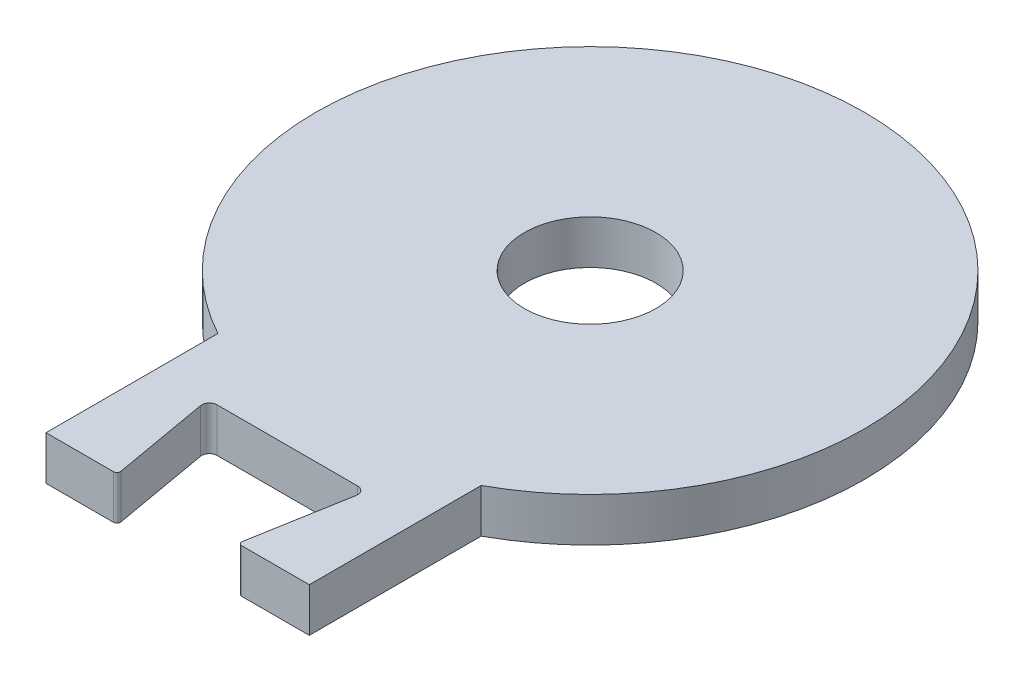
ISO-10303-21;
HEADER;
FILE_DESCRIPTION(('STEP AP214'),'2;1');
FILE_NAME('part.step','',(''),(''),'','','');
FILE_SCHEMA(('AUTOMOTIVE_DESIGN { 1 0 10303 214 1 1 1 1 }'));
ENDSEC;
DATA;
#1=APPLICATION_CONTEXT('core data for automotive mechanical design processes');
#2=APPLICATION_PROTOCOL_DEFINITION('international standard','automotive_design',2000,#1);
#3=PRODUCT_CONTEXT('',#1,'mechanical');
#4=PRODUCT('Part','Part','',(#3));
#5=PRODUCT_RELATED_PRODUCT_CATEGORY('part','',(#4));
#6=PRODUCT_DEFINITION_FORMATION('','',#4);
#7=PRODUCT_DEFINITION_CONTEXT('part definition',#1,'design');
#8=PRODUCT_DEFINITION('design','',#6,#7);
#9=PRODUCT_DEFINITION_SHAPE('','',#8);
#10=(LENGTH_UNIT() NAMED_UNIT(*) SI_UNIT(.MILLI.,.METRE.));
#11=(NAMED_UNIT(*) PLANE_ANGLE_UNIT() SI_UNIT($,.RADIAN.));
#12=(NAMED_UNIT(*) SI_UNIT($,.STERADIAN.) SOLID_ANGLE_UNIT());
#13=UNCERTAINTY_MEASURE_WITH_UNIT(LENGTH_MEASURE(1.E-05),#10,'distance_accuracy_value','');
#14=(GEOMETRIC_REPRESENTATION_CONTEXT(3) GLOBAL_UNCERTAINTY_ASSIGNED_CONTEXT((#13)) GLOBAL_UNIT_ASSIGNED_CONTEXT((#10,
#11,#12)) REPRESENTATION_CONTEXT('',''));
#15=CARTESIAN_POINT('',(0.,0.,0.));
#16=DIRECTION('',(0.,0.,1.));
#17=DIRECTION('',(1.,0.,0.));
#18=AXIS2_PLACEMENT_3D('',#15,#16,#17);
#19=CARTESIAN_POINT('',(-6.,2.,13.2915026221292));
#20=DIRECTION('',(1.,0.,0.));
#21=DIRECTION('',(0.,0.,-1.));
#22=AXIS2_PLACEMENT_3D('',#19,#20,#21);
#23=PLANE('',#22);
#24=DIRECTION('',(0.,0.,1.));
#25=VECTOR('',#24,1.);
#26=CARTESIAN_POINT('',(-6.,0.,13.2915026221292));
#27=LINE('',#26,#25);
#28=CARTESIAN_POINT('',(-6.,0.,10.9658560997307));
#29=VERTEX_POINT('',#28);
#30=CARTESIAN_POINT('',(-6.,0.,18.8));
#31=VERTEX_POINT('',#30);
#32=EDGE_CURVE('E171',#29,#31,#27,.T.);
#33=ORIENTED_EDGE('',*,*,#32,.T.);
#34=DIRECTION('',(0.,1.,0.));
#35=VECTOR('',#34,1.);
#36=CARTESIAN_POINT('',(-6.,-2.,18.8));
#37=LINE('',#36,#35);
#38=CARTESIAN_POINT('',(-6.,2.,18.8));
#39=VERTEX_POINT('',#38);
#40=EDGE_CURVE('E144',#31,#39,#37,.T.);
#41=ORIENTED_EDGE('',*,*,#40,.T.);
#42=DIRECTION('',(0.,0.,1.));
#43=VECTOR('',#42,1.);
#44=CARTESIAN_POINT('',(-6.,2.,-6.));
#45=LINE('',#44,#43);
#46=CARTESIAN_POINT('',(-6.,2.,10.9658560997307));
#47=VERTEX_POINT('',#46);
#48=EDGE_CURVE('E186',#47,#39,#45,.T.);
#49=ORIENTED_EDGE('',*,*,#48,.F.);
#50=DIRECTION('',(0.,-1.,0.));
#51=VECTOR('',#50,1.);
#52=CARTESIAN_POINT('',(-6.,2.,10.9658560997307));
#53=LINE('',#52,#51);
#54=EDGE_CURVE('E250',#29,#47,#53,.F.);
#55=ORIENTED_EDGE('',*,*,#54,.F.);
#56=EDGE_LOOP('',(#33,#41,#49,#55));
#57=FACE_BOUND('',#56,.T.);
#58=ADVANCED_FACE('F39',(#57),#23,.F.);
#59=CARTESIAN_POINT('',(6.,2.,13.2915026221292));
#60=DIRECTION('',(-1.,0.,0.));
#61=DIRECTION('',(0.,0.,1.));
#62=AXIS2_PLACEMENT_3D('',#59,#60,#61);
#63=PLANE('',#62);
#64=DIRECTION('',(0.,0.,-1.));
#65=VECTOR('',#64,1.);
#66=CARTESIAN_POINT('',(6.,2.,19.));
#67=LINE('',#66,#65);
#68=CARTESIAN_POINT('',(6.,2.,18.8));
#69=VERTEX_POINT('',#68);
#70=CARTESIAN_POINT('',(6.,2.,10.9658560997307));
#71=VERTEX_POINT('',#70);
#72=EDGE_CURVE('E151',#69,#71,#67,.T.);
#73=ORIENTED_EDGE('',*,*,#72,.F.);
#74=DIRECTION('',(0.,1.,0.));
#75=VECTOR('',#74,1.);
#76=CARTESIAN_POINT('',(6.,-2.,18.8));
#77=LINE('',#76,#75);
#78=CARTESIAN_POINT('',(6.,0.,18.8));
#79=VERTEX_POINT('',#78);
#80=EDGE_CURVE('E134',#79,#69,#77,.T.);
#81=ORIENTED_EDGE('',*,*,#80,.F.);
#82=DIRECTION('',(0.,0.,-1.));
#83=VECTOR('',#82,1.);
#84=CARTESIAN_POINT('',(6.,0.,13.2915026221292));
#85=LINE('',#84,#83);
#86=CARTESIAN_POINT('',(6.,0.,10.9658560997307));
#87=VERTEX_POINT('',#86);
#88=EDGE_CURVE('E184',#79,#87,#85,.T.);
#89=ORIENTED_EDGE('',*,*,#88,.T.);
#90=DIRECTION('',(0.,-1.,0.));
#91=VECTOR('',#90,1.);
#92=CARTESIAN_POINT('',(6.,2.,10.9658560997307));
#93=LINE('',#92,#91);
#94=EDGE_CURVE('E158',#71,#87,#93,.T.);
#95=ORIENTED_EDGE('',*,*,#94,.F.);
#96=EDGE_LOOP('',(#73,#81,#89,#95));
#97=FACE_BOUND('',#96,.T.);
#98=ADVANCED_FACE('F156',(#97),#63,.F.);
#99=CARTESIAN_POINT('',(0.,2.,0.));
#100=DIRECTION('',(0.,1.,0.));
#101=DIRECTION('',(0.,0.,1.));
#102=AXIS2_PLACEMENT_3D('',#99,#100,#101);
#103=PLANE('',#102);
#104=DIRECTION('',(-0.173648177666934,0.,0.984807753012207));
#105=VECTOR('',#104,1.);
#106=CARTESIAN_POINT('',(2.70227505957538,2.,19.));
#107=LINE('',#106,#105);
#108=CARTESIAN_POINT('',(3.54674431540572,2.,14.2107768621834));
#109=VERTEX_POINT('',#108);
#110=CARTESIAN_POINT('',(2.76858233165438,2.,18.62395277335));
#111=VERTEX_POINT('',#110);
#112=EDGE_CURVE('E161',#109,#111,#107,.T.);
#113=ORIENTED_EDGE('',*,*,#112,.T.);
#114=CARTESIAN_POINT('',(2.91630349460621,2.,18.65));
#115=DIRECTION('',(0.,1.,0.));
#116=DIRECTION('',(0.,0.,1.));
#117=AXIS2_PLACEMENT_3D('',#114,#115,#116);
#118=CIRCLE('',#117,0.15);
#119=CARTESIAN_POINT('',(2.91630349460621,2.,18.8));
#120=VERTEX_POINT('',#119);
#121=EDGE_CURVE('E153',#111,#120,#118,.T.);
#122=ORIENTED_EDGE('',*,*,#121,.T.);
#123=DIRECTION('',(-1.,0.,0.));
#124=VECTOR('',#123,1.);
#125=CARTESIAN_POINT('',(-6.,2.,18.8));
#126=LINE('',#125,#124);
#127=EDGE_CURVE('E137',#69,#120,#126,.T.);
#128=ORIENTED_EDGE('',*,*,#127,.F.);
#129=ORIENTED_EDGE('',*,*,#72,.T.);
#130=CARTESIAN_POINT('',(0.,2.,0.));
#131=DIRECTION('',(0.,1.,0.));
#132=DIRECTION('',(0.,0.,1.));
#133=AXIS2_PLACEMENT_3D('',#130,#131,#132);
#134=CIRCLE('',#133,12.5);
#135=EDGE_CURVE('E256',#71,#47,#134,.T.);
#136=ORIENTED_EDGE('',*,*,#135,.T.);
#137=ORIENTED_EDGE('',*,*,#48,.T.);
#138=CARTESIAN_POINT('',(-2.91630349460621,2.,18.8));
#139=VERTEX_POINT('',#138);
#140=EDGE_CURVE('E154',#139,#39,#126,.T.);
#141=ORIENTED_EDGE('',*,*,#140,.F.);
#142=CARTESIAN_POINT('',(-2.91630349460621,2.,18.65));
#143=DIRECTION('',(0.,1.,0.));
#144=DIRECTION('',(0.,0.,1.));
#145=AXIS2_PLACEMENT_3D('',#142,#143,#144);
#146=CIRCLE('',#145,0.15);
#147=CARTESIAN_POINT('',(-2.76858233165438,2.,18.62395277335));
#148=VERTEX_POINT('',#147);
#149=EDGE_CURVE('E215',#139,#148,#146,.T.);
#150=ORIENTED_EDGE('',*,*,#149,.T.);
#151=DIRECTION('',(-0.173648177666935,0.,-0.984807753012207));
#152=VECTOR('',#151,1.);
#153=CARTESIAN_POINT('',(-2.70227505957538,2.,19.));
#154=LINE('',#153,#152);
#155=CARTESIAN_POINT('',(-3.54674431540572,2.,14.2107768621834));
#156=VERTEX_POINT('',#155);
#157=EDGE_CURVE('E225',#148,#156,#154,.T.);
#158=ORIENTED_EDGE('',*,*,#157,.T.);
#159=CARTESIAN_POINT('',(-3.20206160185145,2.,14.15));
#160=DIRECTION('',(0.,1.,0.));
#161=DIRECTION('',(0.,0.,1.));
#162=AXIS2_PLACEMENT_3D('',#159,#160,#161);
#163=CIRCLE('',#162,0.35);
#164=CARTESIAN_POINT('',(-3.20206160185145,2.,13.8));
#165=VERTEX_POINT('',#164);
#166=EDGE_CURVE('E209',#156,#165,#163,.F.);
#167=ORIENTED_EDGE('',*,*,#166,.T.);
#168=DIRECTION('',(1.,0.,0.));
#169=VECTOR('',#168,1.);
#170=CARTESIAN_POINT('',(-3.61917535925942,2.,13.8));
#171=LINE('',#170,#169);
#172=CARTESIAN_POINT('',(3.20206160185144,2.,13.8));
#173=VERTEX_POINT('',#172);
#174=EDGE_CURVE('E167',#165,#173,#171,.T.);
#175=ORIENTED_EDGE('',*,*,#174,.T.);
#176=CARTESIAN_POINT('',(3.20206160185145,2.,14.15));
#177=DIRECTION('',(0.,1.,0.));
#178=DIRECTION('',(0.,0.,1.));
#179=AXIS2_PLACEMENT_3D('',#176,#177,#178);
#180=CIRCLE('',#179,0.35);
#181=EDGE_CURVE('E203',#173,#109,#180,.F.);
#182=ORIENTED_EDGE('',*,*,#181,.T.);
#183=EDGE_LOOP('',(#113,#122,#128,#129,#136,#137,#141,#150,#158,#167,#175,#182));
#184=FACE_BOUND('',#183,.T.);
#185=CARTESIAN_POINT('',(0.,2.,0.));
#186=DIRECTION('',(0.,1.,0.));
#187=DIRECTION('',(0.,0.,1.));
#188=AXIS2_PLACEMENT_3D('',#185,#186,#187);
#189=CIRCLE('',#188,3.);
#190=CARTESIAN_POINT('',(0.,2.,3.));
#191=VERTEX_POINT('',#190);
#192=EDGE_CURVE('E176',#191,#191,#189,.T.);
#193=ORIENTED_EDGE('',*,*,#192,.F.);
#194=EDGE_LOOP('',(#193));
#195=FACE_BOUND('',#194,.T.);
#196=ADVANCED_FACE('F148',(#184,#195),#103,.T.);
#197=CARTESIAN_POINT('',(0.,0.,0.));
#198=DIRECTION('',(0.,1.,0.));
#199=DIRECTION('',(0.,0.,1.));
#200=AXIS2_PLACEMENT_3D('',#197,#198,#199);
#201=PLANE('',#200);
#202=DIRECTION('',(-1.,0.,0.));
#203=VECTOR('',#202,1.);
#204=CARTESIAN_POINT('',(0.,0.,18.8));
#205=LINE('',#204,#203);
#206=CARTESIAN_POINT('',(2.91630349460621,0.,18.8));
#207=VERTEX_POINT('',#206);
#208=EDGE_CURVE('E140',#79,#207,#205,.T.);
#209=ORIENTED_EDGE('',*,*,#208,.T.);
#210=CARTESIAN_POINT('',(2.91630349460621,0.,18.65));
#211=DIRECTION('',(0.,1.,0.));
#212=DIRECTION('',(0.,0.,1.));
#213=AXIS2_PLACEMENT_3D('',#210,#211,#212);
#214=CIRCLE('',#213,0.15);
#215=CARTESIAN_POINT('',(2.76858233165438,0.,18.62395277335));
#216=VERTEX_POINT('',#215);
#217=EDGE_CURVE('E221',#207,#216,#214,.F.);
#218=ORIENTED_EDGE('',*,*,#217,.T.);
#219=DIRECTION('',(-0.173648177666934,0.,0.984807753012207));
#220=VECTOR('',#219,1.);
#221=CARTESIAN_POINT('',(2.70227505957538,0.,19.));
#222=LINE('',#221,#220);
#223=CARTESIAN_POINT('',(3.54674431540572,0.,14.2107768621834));
#224=VERTEX_POINT('',#223);
#225=EDGE_CURVE('E181',#224,#216,#222,.T.);
#226=ORIENTED_EDGE('',*,*,#225,.F.);
#227=CARTESIAN_POINT('',(3.20206160185145,0.,14.15));
#228=DIRECTION('',(0.,1.,0.));
#229=DIRECTION('',(0.,0.,1.));
#230=AXIS2_PLACEMENT_3D('',#227,#228,#229);
#231=CIRCLE('',#230,0.35);
#232=CARTESIAN_POINT('',(3.20206160185145,0.,13.8));
#233=VERTEX_POINT('',#232);
#234=EDGE_CURVE('E201',#224,#233,#231,.T.);
#235=ORIENTED_EDGE('',*,*,#234,.T.);
#236=DIRECTION('',(1.,0.,0.));
#237=VECTOR('',#236,1.);
#238=CARTESIAN_POINT('',(3.61917535925942,0.,13.8));
#239=LINE('',#238,#237);
#240=CARTESIAN_POINT('',(-3.20206160185144,0.,13.8));
#241=VERTEX_POINT('',#240);
#242=EDGE_CURVE('E178',#241,#233,#239,.T.);
#243=ORIENTED_EDGE('',*,*,#242,.F.);
#244=CARTESIAN_POINT('',(-3.20206160185145,0.,14.15));
#245=DIRECTION('',(0.,1.,0.));
#246=DIRECTION('',(0.,0.,1.));
#247=AXIS2_PLACEMENT_3D('',#244,#245,#246);
#248=CIRCLE('',#247,0.35);
#249=CARTESIAN_POINT('',(-3.54674431540572,0.,14.2107768621834));
#250=VERTEX_POINT('',#249);
#251=EDGE_CURVE('E206',#241,#250,#248,.T.);
#252=ORIENTED_EDGE('',*,*,#251,.T.);
#253=DIRECTION('',(-0.173648177666935,0.,-0.984807753012207));
#254=VECTOR('',#253,1.);
#255=CARTESIAN_POINT('',(-2.70227505957538,0.,19.));
#256=LINE('',#255,#254);
#257=CARTESIAN_POINT('',(-2.76858233165438,0.,18.62395277335));
#258=VERTEX_POINT('',#257);
#259=EDGE_CURVE('E175',#258,#250,#256,.T.);
#260=ORIENTED_EDGE('',*,*,#259,.F.);
#261=CARTESIAN_POINT('',(-2.91630349460621,0.,18.65));
#262=DIRECTION('',(0.,1.,0.));
#263=DIRECTION('',(0.,0.,1.));
#264=AXIS2_PLACEMENT_3D('',#261,#262,#263);
#265=CIRCLE('',#264,0.15);
#266=CARTESIAN_POINT('',(-2.91630349460621,0.,18.8));
#267=VERTEX_POINT('',#266);
#268=EDGE_CURVE('E54',#258,#267,#265,.F.);
#269=ORIENTED_EDGE('',*,*,#268,.T.);
#270=EDGE_CURVE('E261',#267,#31,#205,.T.);
#271=ORIENTED_EDGE('',*,*,#270,.T.);
#272=ORIENTED_EDGE('',*,*,#32,.F.);
#273=CARTESIAN_POINT('',(0.,0.,0.));
#274=DIRECTION('',(0.,1.,0.));
#275=DIRECTION('',(0.,0.,1.));
#276=AXIS2_PLACEMENT_3D('',#273,#274,#275);
#277=CIRCLE('',#276,12.5);
#278=EDGE_CURVE('E257',#87,#29,#277,.T.);
#279=ORIENTED_EDGE('',*,*,#278,.F.);
#280=ORIENTED_EDGE('',*,*,#88,.F.);
#281=EDGE_LOOP('',(#209,#218,#226,#235,#243,#252,#260,#269,#271,#272,#279,#280));
#282=FACE_BOUND('',#281,.T.);
#283=CARTESIAN_POINT('',(0.,0.,0.));
#284=DIRECTION('',(0.,1.,0.));
#285=DIRECTION('',(0.,0.,1.));
#286=AXIS2_PLACEMENT_3D('',#283,#284,#285);
#287=CIRCLE('',#286,3.);
#288=CARTESIAN_POINT('',(0.,0.,3.));
#289=VERTEX_POINT('',#288);
#290=EDGE_CURVE('E247',#289,#289,#287,.T.);
#291=ORIENTED_EDGE('',*,*,#290,.T.);
#292=EDGE_LOOP('',(#291));
#293=FACE_BOUND('',#292,.T.);
#294=ADVANCED_FACE('F227',(#282,#293),#201,.F.);
#295=CARTESIAN_POINT('',(-2.70227505957538,2.,19.));
#296=DIRECTION('',(-0.984807753012207,0.,0.173648177666935));
#297=DIRECTION('',(0.173648177666935,0.,0.984807753012207));
#298=AXIS2_PLACEMENT_3D('',#295,#296,#297);
#299=PLANE('',#298);
#300=ORIENTED_EDGE('',*,*,#157,.F.);
#301=DIRECTION('',(0.,-1.,0.));
#302=VECTOR('',#301,1.);
#303=CARTESIAN_POINT('',(-2.76858233165438,2.,18.62395277335));
#304=LINE('',#303,#302);
#305=EDGE_CURVE('E47',#148,#258,#304,.T.);
#306=ORIENTED_EDGE('',*,*,#305,.T.);
#307=ORIENTED_EDGE('',*,*,#259,.T.);
#308=DIRECTION('',(0.,-1.,0.));
#309=VECTOR('',#308,1.);
#310=CARTESIAN_POINT('',(-3.54674431540572,2.,14.2107768621834));
#311=LINE('',#310,#309);
#312=EDGE_CURVE('E198',#250,#156,#311,.F.);
#313=ORIENTED_EDGE('',*,*,#312,.T.);
#314=EDGE_LOOP('',(#300,#306,#307,#313));
#315=FACE_BOUND('',#314,.T.);
#316=ADVANCED_FACE('F224',(#315),#299,.F.);
#317=CARTESIAN_POINT('',(3.61917535925942,2.,13.8));
#318=DIRECTION('',(0.,0.,-1.));
#319=DIRECTION('',(-1.,0.,0.));
#320=AXIS2_PLACEMENT_3D('',#317,#318,#319);
#321=PLANE('',#320);
#322=ORIENTED_EDGE('',*,*,#242,.T.);
#323=DIRECTION('',(0.,-1.,0.));
#324=VECTOR('',#323,1.);
#325=CARTESIAN_POINT('',(3.20206160185145,2.,13.8));
#326=LINE('',#325,#324);
#327=EDGE_CURVE('E195',#233,#173,#326,.F.);
#328=ORIENTED_EDGE('',*,*,#327,.T.);
#329=ORIENTED_EDGE('',*,*,#174,.F.);
#330=DIRECTION('',(0.,-1.,0.));
#331=VECTOR('',#330,1.);
#332=CARTESIAN_POINT('',(-3.20206160185145,0.,13.8));
#333=LINE('',#332,#331);
#334=EDGE_CURVE('E191',#165,#241,#333,.T.);
#335=ORIENTED_EDGE('',*,*,#334,.T.);
#336=EDGE_LOOP('',(#322,#328,#329,#335));
#337=FACE_BOUND('',#336,.T.);
#338=ADVANCED_FACE('F239',(#337),#321,.F.);
#339=CARTESIAN_POINT('',(2.70227505957538,2.,19.));
#340=DIRECTION('',(0.984807753012207,0.,0.173648177666934));
#341=DIRECTION('',(0.173648177666934,0.,-0.984807753012207));
#342=AXIS2_PLACEMENT_3D('',#339,#340,#341);
#343=PLANE('',#342);
#344=ORIENTED_EDGE('',*,*,#225,.T.);
#345=DIRECTION('',(0.,1.,0.));
#346=VECTOR('',#345,1.);
#347=CARTESIAN_POINT('',(2.76858233165438,2.,18.62395277335));
#348=LINE('',#347,#346);
#349=EDGE_CURVE('E212',#216,#111,#348,.T.);
#350=ORIENTED_EDGE('',*,*,#349,.T.);
#351=ORIENTED_EDGE('',*,*,#112,.F.);
#352=DIRECTION('',(0.,-1.,0.));
#353=VECTOR('',#352,1.);
#354=CARTESIAN_POINT('',(3.54674431540572,0.,14.2107768621834));
#355=LINE('',#354,#353);
#356=EDGE_CURVE('E165',#109,#224,#355,.T.);
#357=ORIENTED_EDGE('',*,*,#356,.T.);
#358=EDGE_LOOP('',(#344,#350,#351,#357));
#359=FACE_BOUND('',#358,.T.);
#360=ADVANCED_FACE('F331',(#359),#343,.F.);
#361=CARTESIAN_POINT('',(0.,2.,0.));
#362=DIRECTION('',(0.,-1.,0.));
#363=DIRECTION('',(0.,0.,-1.));
#364=AXIS2_PLACEMENT_3D('',#361,#362,#363);
#365=CYLINDRICAL_SURFACE('',#364,3.);
#366=ORIENTED_EDGE('',*,*,#192,.T.);
#367=EDGE_LOOP('',(#366));
#368=FACE_BOUND('',#367,.T.);
#369=ORIENTED_EDGE('',*,*,#290,.F.);
#370=EDGE_LOOP('',(#369));
#371=FACE_BOUND('',#370,.T.);
#372=ADVANCED_FACE('F336',(#368,#371),#365,.F.);
#373=CARTESIAN_POINT('',(0.,2.,0.));
#374=DIRECTION('',(0.,-1.,0.));
#375=DIRECTION('',(0.,0.,-1.));
#376=AXIS2_PLACEMENT_3D('',#373,#374,#375);
#377=CYLINDRICAL_SURFACE('',#376,12.5);
#378=ORIENTED_EDGE('',*,*,#278,.T.);
#379=ORIENTED_EDGE('',*,*,#54,.T.);
#380=ORIENTED_EDGE('',*,*,#135,.F.);
#381=ORIENTED_EDGE('',*,*,#94,.T.);
#382=EDGE_LOOP('',(#378,#379,#380,#381));
#383=FACE_BOUND('',#382,.T.);
#384=ADVANCED_FACE('F272',(#383),#377,.T.);
#385=CARTESIAN_POINT('',(-6.,-2.,18.8));
#386=DIRECTION('',(0.,0.,-1.));
#387=DIRECTION('',(-1.,0.,0.));
#388=AXIS2_PLACEMENT_3D('',#385,#386,#387);
#389=PLANE('',#388);
#390=ORIENTED_EDGE('',*,*,#127,.T.);
#391=DIRECTION('',(0.,1.,0.));
#392=VECTOR('',#391,1.);
#393=CARTESIAN_POINT('',(2.91630349460621,-2.,18.8));
#394=LINE('',#393,#392);
#395=EDGE_CURVE('E218',#120,#207,#394,.F.);
#396=ORIENTED_EDGE('',*,*,#395,.T.);
#397=ORIENTED_EDGE('',*,*,#208,.F.);
#398=ORIENTED_EDGE('',*,*,#80,.T.);
#399=EDGE_LOOP('',(#390,#396,#397,#398));
#400=FACE_BOUND('',#399,.T.);
#401=ADVANCED_FACE('F136',(#400),#389,.F.);
#402=ORIENTED_EDGE('',*,*,#270,.F.);
#403=DIRECTION('',(0.,-1.,0.));
#404=VECTOR('',#403,1.);
#405=CARTESIAN_POINT('',(-2.91630349460621,-2.,18.8));
#406=LINE('',#405,#404);
#407=EDGE_CURVE('E11',#267,#139,#406,.F.);
#408=ORIENTED_EDGE('',*,*,#407,.T.);
#409=ORIENTED_EDGE('',*,*,#140,.T.);
#410=ORIENTED_EDGE('',*,*,#40,.F.);
#411=EDGE_LOOP('',(#402,#408,#409,#410));
#412=FACE_BOUND('',#411,.T.);
#413=ADVANCED_FACE('F274',(#412),#389,.F.);
#414=CARTESIAN_POINT('',(3.20206160185145,2.,14.15));
#415=DIRECTION('',(0.,1.,0.));
#416=DIRECTION('',(0.,0.,1.));
#417=AXIS2_PLACEMENT_3D('',#414,#415,#416);
#418=CYLINDRICAL_SURFACE('',#417,0.35);
#419=ORIENTED_EDGE('',*,*,#181,.F.);
#420=ORIENTED_EDGE('',*,*,#327,.F.);
#421=ORIENTED_EDGE('',*,*,#234,.F.);
#422=ORIENTED_EDGE('',*,*,#356,.F.);
#423=EDGE_LOOP('',(#419,#420,#421,#422));
#424=FACE_BOUND('',#423,.T.);
#425=ADVANCED_FACE('F290',(#424),#418,.F.);
#426=CARTESIAN_POINT('',(-3.20206160185145,2.,14.15));
#427=DIRECTION('',(0.,1.,0.));
#428=DIRECTION('',(0.,0.,1.));
#429=AXIS2_PLACEMENT_3D('',#426,#427,#428);
#430=CYLINDRICAL_SURFACE('',#429,0.35);
#431=ORIENTED_EDGE('',*,*,#166,.F.);
#432=ORIENTED_EDGE('',*,*,#312,.F.);
#433=ORIENTED_EDGE('',*,*,#251,.F.);
#434=ORIENTED_EDGE('',*,*,#334,.F.);
#435=EDGE_LOOP('',(#431,#432,#433,#434));
#436=FACE_BOUND('',#435,.T.);
#437=ADVANCED_FACE('F234',(#436),#430,.F.);
#438=CARTESIAN_POINT('',(2.91630349460621,2.,18.65));
#439=DIRECTION('',(0.,1.,0.));
#440=DIRECTION('',(0.,0.,1.));
#441=AXIS2_PLACEMENT_3D('',#438,#439,#440);
#442=CYLINDRICAL_SURFACE('',#441,0.15);
#443=ORIENTED_EDGE('',*,*,#217,.F.);
#444=ORIENTED_EDGE('',*,*,#395,.F.);
#445=ORIENTED_EDGE('',*,*,#121,.F.);
#446=ORIENTED_EDGE('',*,*,#349,.F.);
#447=EDGE_LOOP('',(#443,#444,#445,#446));
#448=FACE_BOUND('',#447,.T.);
#449=ADVANCED_FACE('F276',(#448),#442,.T.);
#450=CARTESIAN_POINT('',(-2.91630349460621,2.,18.65));
#451=DIRECTION('',(0.,-1.,0.));
#452=DIRECTION('',(0.,0.,-1.));
#453=AXIS2_PLACEMENT_3D('',#450,#451,#452);
#454=CYLINDRICAL_SURFACE('',#453,0.15);
#455=ORIENTED_EDGE('',*,*,#149,.F.);
#456=ORIENTED_EDGE('',*,*,#407,.F.);
#457=ORIENTED_EDGE('',*,*,#268,.F.);
#458=ORIENTED_EDGE('',*,*,#305,.F.);
#459=EDGE_LOOP('',(#455,#456,#457,#458));
#460=FACE_BOUND('',#459,.T.);
#461=ADVANCED_FACE('F41',(#460),#454,.T.);
#462=CLOSED_SHELL('',(#58,#98,#196,#294,#316,#338,#360,#372,#384,#401,#413,#425,#437,#449,#461));
#463=MANIFOLD_SOLID_BREP('B2',#462);
#464=ADVANCED_BREP_SHAPE_REPRESENTATION('',(#18,#463),#14);
#465=SHAPE_DEFINITION_REPRESENTATION(#9,#464);
ENDSEC;
END-ISO-10303-21;
